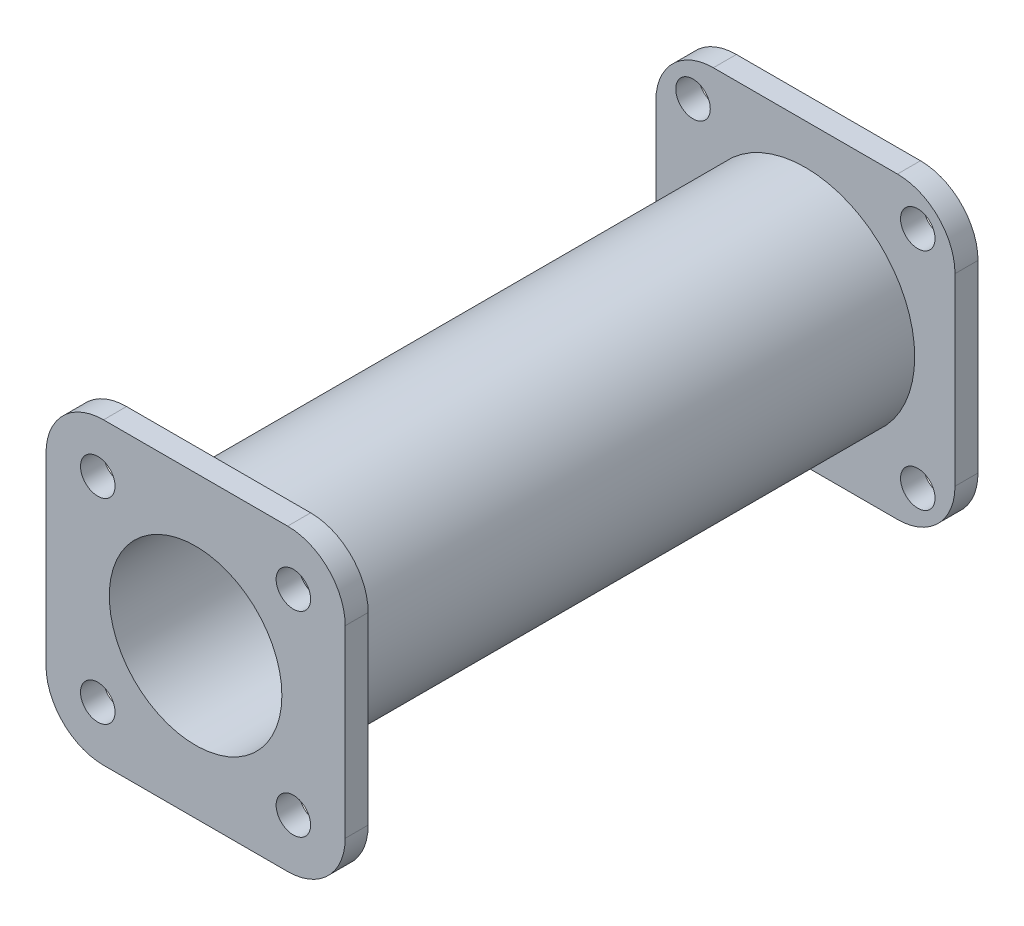
ISO-10303-21;
HEADER;
FILE_DESCRIPTION(('STEP AP214'),'2;1');
FILE_NAME('part.step','',(''),(''),'','','');
FILE_SCHEMA(('AUTOMOTIVE_DESIGN { 1 0 10303 214 1 1 1 1 }'));
ENDSEC;
DATA;
#1=APPLICATION_CONTEXT('core data for automotive mechanical design processes');
#2=APPLICATION_PROTOCOL_DEFINITION('international standard','automotive_design',2000,#1);
#3=PRODUCT_CONTEXT('',#1,'mechanical');
#4=PRODUCT('Part','Part','',(#3));
#5=PRODUCT_RELATED_PRODUCT_CATEGORY('part','',(#4));
#6=PRODUCT_DEFINITION_FORMATION('','',#4);
#7=PRODUCT_DEFINITION_CONTEXT('part definition',#1,'design');
#8=PRODUCT_DEFINITION('design','',#6,#7);
#9=PRODUCT_DEFINITION_SHAPE('','',#8);
#10=(LENGTH_UNIT() NAMED_UNIT(*) SI_UNIT(.MILLI.,.METRE.));
#11=(NAMED_UNIT(*) PLANE_ANGLE_UNIT() SI_UNIT($,.RADIAN.));
#12=(NAMED_UNIT(*) SI_UNIT($,.STERADIAN.) SOLID_ANGLE_UNIT());
#13=UNCERTAINTY_MEASURE_WITH_UNIT(LENGTH_MEASURE(1.E-05),#10,'distance_accuracy_value','');
#14=(GEOMETRIC_REPRESENTATION_CONTEXT(3) GLOBAL_UNCERTAINTY_ASSIGNED_CONTEXT((#13)) GLOBAL_UNIT_ASSIGNED_CONTEXT((#10,
#11,#12)) REPRESENTATION_CONTEXT('',''));
#15=CARTESIAN_POINT('',(0.,0.,0.));
#16=DIRECTION('',(0.,0.,1.));
#17=DIRECTION('',(1.,0.,0.));
#18=AXIS2_PLACEMENT_3D('',#15,#16,#17);
#19=CARTESIAN_POINT('',(0.,0.,55.));
#20=DIRECTION('',(0.,0.,-1.));
#21=DIRECTION('',(-1.,0.,0.));
#22=AXIS2_PLACEMENT_3D('',#19,#20,#21);
#23=CYLINDRICAL_SURFACE('',#22,9.5);
#24=CARTESIAN_POINT('',(0.,0.,2.));
#25=DIRECTION('',(0.,0.,1.));
#26=DIRECTION('',(1.,0.,0.));
#27=AXIS2_PLACEMENT_3D('',#24,#25,#26);
#28=CIRCLE('',#27,9.5);
#29=CARTESIAN_POINT('',(9.5,0.,2.));
#30=VERTEX_POINT('',#29);
#31=EDGE_CURVE('E269',#30,#30,#28,.T.);
#32=ORIENTED_EDGE('',*,*,#31,.T.);
#33=EDGE_LOOP('',(#32));
#34=FACE_BOUND('',#33,.T.);
#35=CARTESIAN_POINT('',(0.,0.,53.));
#36=DIRECTION('',(0.,0.,1.));
#37=DIRECTION('',(1.,0.,0.));
#38=AXIS2_PLACEMENT_3D('',#35,#36,#37);
#39=CIRCLE('',#38,9.5);
#40=CARTESIAN_POINT('',(9.5,0.,53.));
#41=VERTEX_POINT('',#40);
#42=EDGE_CURVE('E11',#41,#41,#39,.T.);
#43=ORIENTED_EDGE('',*,*,#42,.F.);
#44=EDGE_LOOP('',(#43));
#45=FACE_BOUND('',#44,.T.);
#46=ADVANCED_FACE('F43',(#34,#45),#23,.T.);
#47=CARTESIAN_POINT('',(-13.,0.,2.));
#48=DIRECTION('',(1.,0.,0.));
#49=DIRECTION('',(0.,1.,0.));
#50=AXIS2_PLACEMENT_3D('',#47,#48,#49);
#51=PLANE('',#50);
#52=DIRECTION('',(0.,-1.,0.));
#53=VECTOR('',#52,1.);
#54=CARTESIAN_POINT('',(-13.,0.,0.));
#55=LINE('',#54,#53);
#56=CARTESIAN_POINT('',(-13.,7.99999999999999,0.));
#57=VERTEX_POINT('',#56);
#58=CARTESIAN_POINT('',(-13.,-8.,0.));
#59=VERTEX_POINT('',#58);
#60=EDGE_CURVE('E159',#57,#59,#55,.T.);
#61=ORIENTED_EDGE('',*,*,#60,.T.);
#62=DIRECTION('',(0.,0.,-1.));
#63=VECTOR('',#62,1.);
#64=CARTESIAN_POINT('',(-13.,-8.,2.));
#65=LINE('',#64,#63);
#66=CARTESIAN_POINT('',(-13.,-8.,2.));
#67=VERTEX_POINT('',#66);
#68=EDGE_CURVE('E52',#67,#59,#65,.T.);
#69=ORIENTED_EDGE('',*,*,#68,.F.);
#70=DIRECTION('',(0.,-1.,0.));
#71=VECTOR('',#70,1.);
#72=CARTESIAN_POINT('',(-13.,0.,2.));
#73=LINE('',#72,#71);
#74=CARTESIAN_POINT('',(-13.,7.99999999999999,2.));
#75=VERTEX_POINT('',#74);
#76=EDGE_CURVE('E271',#75,#67,#73,.T.);
#77=ORIENTED_EDGE('',*,*,#76,.F.);
#78=DIRECTION('',(0.,0.,-1.));
#79=VECTOR('',#78,1.);
#80=CARTESIAN_POINT('',(-13.,7.99999999999999,2.));
#81=LINE('',#80,#79);
#82=EDGE_CURVE('E60',#75,#57,#81,.T.);
#83=ORIENTED_EDGE('',*,*,#82,.T.);
#84=EDGE_LOOP('',(#61,#69,#77,#83));
#85=FACE_BOUND('',#84,.T.);
#86=ADVANCED_FACE('F190',(#85),#51,.F.);
#87=CARTESIAN_POINT('',(-8.,-7.99999999999999,2.));
#88=DIRECTION('',(0.,0.,-1.));
#89=DIRECTION('',(-1.,0.,0.));
#90=AXIS2_PLACEMENT_3D('',#87,#88,#89);
#91=CYLINDRICAL_SURFACE('',#90,5.);
#92=CARTESIAN_POINT('',(-8.,-7.99999999999999,0.));
#93=DIRECTION('',(0.,0.,1.));
#94=DIRECTION('',(1.,0.,0.));
#95=AXIS2_PLACEMENT_3D('',#92,#93,#94);
#96=CIRCLE('',#95,5.);
#97=CARTESIAN_POINT('',(-7.99999999999999,-13.,0.));
#98=VERTEX_POINT('',#97);
#99=EDGE_CURVE('E161',#59,#98,#96,.T.);
#100=ORIENTED_EDGE('',*,*,#99,.T.);
#101=DIRECTION('',(0.,0.,-1.));
#102=VECTOR('',#101,1.);
#103=CARTESIAN_POINT('',(-7.99999999999999,-13.,2.));
#104=LINE('',#103,#102);
#105=CARTESIAN_POINT('',(-7.99999999999999,-13.,2.));
#106=VERTEX_POINT('',#105);
#107=EDGE_CURVE('E186',#106,#98,#104,.T.);
#108=ORIENTED_EDGE('',*,*,#107,.F.);
#109=CARTESIAN_POINT('',(-8.,-7.99999999999999,2.));
#110=DIRECTION('',(0.,0.,1.));
#111=DIRECTION('',(1.,0.,0.));
#112=AXIS2_PLACEMENT_3D('',#109,#110,#111);
#113=CIRCLE('',#112,5.);
#114=EDGE_CURVE('E100',#67,#106,#113,.T.);
#115=ORIENTED_EDGE('',*,*,#114,.F.);
#116=ORIENTED_EDGE('',*,*,#68,.T.);
#117=EDGE_LOOP('',(#100,#108,#115,#116));
#118=FACE_BOUND('',#117,.T.);
#119=ADVANCED_FACE('F189',(#118),#91,.T.);
#120=CARTESIAN_POINT('',(0.,-13.,2.));
#121=DIRECTION('',(0.,1.,0.));
#122=DIRECTION('',(-1.,0.,0.));
#123=AXIS2_PLACEMENT_3D('',#120,#121,#122);
#124=PLANE('',#123);
#125=DIRECTION('',(1.,0.,0.));
#126=VECTOR('',#125,1.);
#127=CARTESIAN_POINT('',(0.,-13.,0.));
#128=LINE('',#127,#126);
#129=CARTESIAN_POINT('',(8.,-13.,0.));
#130=VERTEX_POINT('',#129);
#131=EDGE_CURVE('E163',#98,#130,#128,.T.);
#132=ORIENTED_EDGE('',*,*,#131,.T.);
#133=DIRECTION('',(0.,0.,-1.));
#134=VECTOR('',#133,1.);
#135=CARTESIAN_POINT('',(8.,-13.,2.));
#136=LINE('',#135,#134);
#137=CARTESIAN_POINT('',(8.,-13.,2.));
#138=VERTEX_POINT('',#137);
#139=EDGE_CURVE('E184',#138,#130,#136,.T.);
#140=ORIENTED_EDGE('',*,*,#139,.F.);
#141=DIRECTION('',(1.,0.,0.));
#142=VECTOR('',#141,1.);
#143=CARTESIAN_POINT('',(0.,-13.,2.));
#144=LINE('',#143,#142);
#145=EDGE_CURVE('E274',#106,#138,#144,.T.);
#146=ORIENTED_EDGE('',*,*,#145,.F.);
#147=ORIENTED_EDGE('',*,*,#107,.T.);
#148=EDGE_LOOP('',(#132,#140,#146,#147));
#149=FACE_BOUND('',#148,.T.);
#150=ADVANCED_FACE('F287',(#149),#124,.F.);
#151=CARTESIAN_POINT('',(8.,-7.99999999999999,2.));
#152=DIRECTION('',(0.,0.,-1.));
#153=DIRECTION('',(-1.,0.,0.));
#154=AXIS2_PLACEMENT_3D('',#151,#152,#153);
#155=CYLINDRICAL_SURFACE('',#154,5.);
#156=CARTESIAN_POINT('',(8.,-7.99999999999999,0.));
#157=DIRECTION('',(0.,0.,1.));
#158=DIRECTION('',(1.,0.,0.));
#159=AXIS2_PLACEMENT_3D('',#156,#157,#158);
#160=CIRCLE('',#159,5.);
#161=CARTESIAN_POINT('',(13.,-8.,0.));
#162=VERTEX_POINT('',#161);
#163=EDGE_CURVE('E166',#162,#130,#160,.F.);
#164=ORIENTED_EDGE('',*,*,#163,.F.);
#165=DIRECTION('',(0.,0.,-1.));
#166=VECTOR('',#165,1.);
#167=CARTESIAN_POINT('',(13.,-8.,2.));
#168=LINE('',#167,#166);
#169=CARTESIAN_POINT('',(13.,-8.,2.));
#170=VERTEX_POINT('',#169);
#171=EDGE_CURVE('E182',#170,#162,#168,.T.);
#172=ORIENTED_EDGE('',*,*,#171,.F.);
#173=CARTESIAN_POINT('',(8.,-7.99999999999999,2.));
#174=DIRECTION('',(0.,0.,1.));
#175=DIRECTION('',(1.,0.,0.));
#176=AXIS2_PLACEMENT_3D('',#173,#174,#175);
#177=CIRCLE('',#176,5.);
#178=EDGE_CURVE('E276',#170,#138,#177,.F.);
#179=ORIENTED_EDGE('',*,*,#178,.T.);
#180=ORIENTED_EDGE('',*,*,#139,.T.);
#181=EDGE_LOOP('',(#164,#172,#179,#180));
#182=FACE_BOUND('',#181,.T.);
#183=ADVANCED_FACE('F283',(#182),#155,.T.);
#184=CARTESIAN_POINT('',(13.,0.,2.));
#185=DIRECTION('',(1.,0.,0.));
#186=DIRECTION('',(0.,0.,-1.));
#187=AXIS2_PLACEMENT_3D('',#184,#185,#186);
#188=PLANE('',#187);
#189=DIRECTION('',(0.,-1.,0.));
#190=VECTOR('',#189,1.);
#191=CARTESIAN_POINT('',(13.,0.,0.));
#192=LINE('',#191,#190);
#193=CARTESIAN_POINT('',(13.,8.,0.));
#194=VERTEX_POINT('',#193);
#195=EDGE_CURVE('E169',#194,#162,#192,.T.);
#196=ORIENTED_EDGE('',*,*,#195,.F.);
#197=DIRECTION('',(0.,0.,-1.));
#198=VECTOR('',#197,1.);
#199=CARTESIAN_POINT('',(13.,8.,2.));
#200=LINE('',#199,#198);
#201=CARTESIAN_POINT('',(13.,8.,2.));
#202=VERTEX_POINT('',#201);
#203=EDGE_CURVE('E128',#202,#194,#200,.T.);
#204=ORIENTED_EDGE('',*,*,#203,.F.);
#205=DIRECTION('',(0.,-1.,0.));
#206=VECTOR('',#205,1.);
#207=CARTESIAN_POINT('',(13.,0.,2.));
#208=LINE('',#207,#206);
#209=EDGE_CURVE('E138',#202,#170,#208,.T.);
#210=ORIENTED_EDGE('',*,*,#209,.T.);
#211=ORIENTED_EDGE('',*,*,#171,.T.);
#212=EDGE_LOOP('',(#196,#204,#210,#211));
#213=FACE_BOUND('',#212,.T.);
#214=ADVANCED_FACE('F280',(#213),#188,.T.);
#215=CARTESIAN_POINT('',(7.99999999999999,8.,2.));
#216=DIRECTION('',(0.,0.,-1.));
#217=DIRECTION('',(-1.,0.,0.));
#218=AXIS2_PLACEMENT_3D('',#215,#216,#217);
#219=CYLINDRICAL_SURFACE('',#218,5.);
#220=CARTESIAN_POINT('',(7.99999999999999,8.,0.));
#221=DIRECTION('',(0.,0.,1.));
#222=DIRECTION('',(1.,0.,0.));
#223=AXIS2_PLACEMENT_3D('',#220,#221,#222);
#224=CIRCLE('',#223,5.);
#225=CARTESIAN_POINT('',(7.99999999999999,13.,0.));
#226=VERTEX_POINT('',#225);
#227=EDGE_CURVE('E124',#226,#194,#224,.F.);
#228=ORIENTED_EDGE('',*,*,#227,.F.);
#229=DIRECTION('',(0.,0.,-1.));
#230=VECTOR('',#229,1.);
#231=CARTESIAN_POINT('',(7.99999999999999,13.,2.));
#232=LINE('',#231,#230);
#233=CARTESIAN_POINT('',(7.99999999999999,13.,2.));
#234=VERTEX_POINT('',#233);
#235=EDGE_CURVE('E119',#234,#226,#232,.T.);
#236=ORIENTED_EDGE('',*,*,#235,.F.);
#237=CARTESIAN_POINT('',(7.99999999999999,8.,2.));
#238=DIRECTION('',(0.,0.,1.));
#239=DIRECTION('',(1.,0.,0.));
#240=AXIS2_PLACEMENT_3D('',#237,#238,#239);
#241=CIRCLE('',#240,5.);
#242=EDGE_CURVE('E122',#234,#202,#241,.F.);
#243=ORIENTED_EDGE('',*,*,#242,.T.);
#244=ORIENTED_EDGE('',*,*,#203,.T.);
#245=EDGE_LOOP('',(#228,#236,#243,#244));
#246=FACE_BOUND('',#245,.T.);
#247=ADVANCED_FACE('F121',(#246),#219,.T.);
#248=CARTESIAN_POINT('',(0.,13.,2.));
#249=DIRECTION('',(0.,1.,0.));
#250=DIRECTION('',(-1.,0.,0.));
#251=AXIS2_PLACEMENT_3D('',#248,#249,#250);
#252=PLANE('',#251);
#253=DIRECTION('',(1.,0.,0.));
#254=VECTOR('',#253,1.);
#255=CARTESIAN_POINT('',(0.,13.,0.));
#256=LINE('',#255,#254);
#257=CARTESIAN_POINT('',(-7.99999999999999,13.,0.));
#258=VERTEX_POINT('',#257);
#259=EDGE_CURVE('E173',#258,#226,#256,.T.);
#260=ORIENTED_EDGE('',*,*,#259,.F.);
#261=DIRECTION('',(0.,0.,-1.));
#262=VECTOR('',#261,1.);
#263=CARTESIAN_POINT('',(-7.99999999999999,13.,2.));
#264=LINE('',#263,#262);
#265=CARTESIAN_POINT('',(-7.99999999999999,13.,2.));
#266=VERTEX_POINT('',#265);
#267=EDGE_CURVE('E87',#266,#258,#264,.T.);
#268=ORIENTED_EDGE('',*,*,#267,.F.);
#269=DIRECTION('',(1.,0.,0.));
#270=VECTOR('',#269,1.);
#271=CARTESIAN_POINT('',(0.,13.,2.));
#272=LINE('',#271,#270);
#273=EDGE_CURVE('E135',#266,#234,#272,.T.);
#274=ORIENTED_EDGE('',*,*,#273,.T.);
#275=ORIENTED_EDGE('',*,*,#235,.T.);
#276=EDGE_LOOP('',(#260,#268,#274,#275));
#277=FACE_BOUND('',#276,.T.);
#278=ADVANCED_FACE('F140',(#277),#252,.T.);
#279=CARTESIAN_POINT('',(-9.76776695296637,9.76776695296636,2.));
#280=DIRECTION('',(0.,0.,-1.));
#281=DIRECTION('',(-1.,0.,0.));
#282=AXIS2_PLACEMENT_3D('',#279,#280,#281);
#283=CYLINDRICAL_SURFACE('',#282,1.5);
#284=CARTESIAN_POINT('',(-9.76776695296637,9.76776695296636,2.));
#285=DIRECTION('',(0.,0.,1.));
#286=DIRECTION('',(1.,0.,0.));
#287=AXIS2_PLACEMENT_3D('',#284,#285,#286);
#288=CIRCLE('',#287,1.5);
#289=CARTESIAN_POINT('',(-8.26776695296638,9.76776695296636,2.));
#290=VERTEX_POINT('',#289);
#291=EDGE_CURVE('E262',#290,#290,#288,.T.);
#292=ORIENTED_EDGE('',*,*,#291,.T.);
#293=EDGE_LOOP('',(#292));
#294=FACE_BOUND('',#293,.T.);
#295=CARTESIAN_POINT('',(-9.76776695296637,9.76776695296636,0.));
#296=DIRECTION('',(0.,0.,1.));
#297=DIRECTION('',(1.,0.,0.));
#298=AXIS2_PLACEMENT_3D('',#295,#296,#297);
#299=CIRCLE('',#298,1.5);
#300=CARTESIAN_POINT('',(-8.26776695296638,9.76776695296636,0.));
#301=VERTEX_POINT('',#300);
#302=EDGE_CURVE('E156',#301,#301,#299,.T.);
#303=ORIENTED_EDGE('',*,*,#302,.F.);
#304=EDGE_LOOP('',(#303));
#305=FACE_BOUND('',#304,.T.);
#306=ADVANCED_FACE('F237',(#294,#305),#283,.F.);
#307=CARTESIAN_POINT('',(-9.76776695296637,-9.76776695296636,2.));
#308=DIRECTION('',(0.,0.,-1.));
#309=DIRECTION('',(-1.,0.,0.));
#310=AXIS2_PLACEMENT_3D('',#307,#308,#309);
#311=CYLINDRICAL_SURFACE('',#310,1.5);
#312=CARTESIAN_POINT('',(-9.76776695296637,-9.76776695296636,2.));
#313=DIRECTION('',(0.,0.,1.));
#314=DIRECTION('',(1.,0.,0.));
#315=AXIS2_PLACEMENT_3D('',#312,#313,#314);
#316=CIRCLE('',#315,1.5);
#317=CARTESIAN_POINT('',(-8.26776695296637,-9.76776695296636,2.));
#318=VERTEX_POINT('',#317);
#319=EDGE_CURVE('E259',#318,#318,#316,.T.);
#320=ORIENTED_EDGE('',*,*,#319,.T.);
#321=EDGE_LOOP('',(#320));
#322=FACE_BOUND('',#321,.T.);
#323=CARTESIAN_POINT('',(-9.76776695296637,-9.76776695296636,0.));
#324=DIRECTION('',(0.,0.,1.));
#325=DIRECTION('',(1.,0.,0.));
#326=AXIS2_PLACEMENT_3D('',#323,#324,#325);
#327=CIRCLE('',#326,1.5);
#328=CARTESIAN_POINT('',(-8.26776695296637,-9.76776695296636,0.));
#329=VERTEX_POINT('',#328);
#330=EDGE_CURVE('E153',#329,#329,#327,.T.);
#331=ORIENTED_EDGE('',*,*,#330,.F.);
#332=EDGE_LOOP('',(#331));
#333=FACE_BOUND('',#332,.T.);
#334=ADVANCED_FACE('F239',(#322,#333),#311,.F.);
#335=CARTESIAN_POINT('',(9.76776695296637,9.76776695296637,2.));
#336=DIRECTION('',(0.,0.,-1.));
#337=DIRECTION('',(-1.,0.,0.));
#338=AXIS2_PLACEMENT_3D('',#335,#336,#337);
#339=CYLINDRICAL_SURFACE('',#338,1.5);
#340=CARTESIAN_POINT('',(9.76776695296637,9.76776695296637,2.));
#341=DIRECTION('',(0.,0.,1.));
#342=DIRECTION('',(1.,0.,0.));
#343=AXIS2_PLACEMENT_3D('',#340,#341,#342);
#344=CIRCLE('',#343,1.5);
#345=CARTESIAN_POINT('',(11.2677669529664,9.76776695296637,2.));
#346=VERTEX_POINT('',#345);
#347=EDGE_CURVE('E257',#346,#346,#344,.T.);
#348=ORIENTED_EDGE('',*,*,#347,.T.);
#349=EDGE_LOOP('',(#348));
#350=FACE_BOUND('',#349,.T.);
#351=CARTESIAN_POINT('',(9.76776695296637,9.76776695296637,0.));
#352=DIRECTION('',(0.,0.,1.));
#353=DIRECTION('',(1.,0.,0.));
#354=AXIS2_PLACEMENT_3D('',#351,#352,#353);
#355=CIRCLE('',#354,1.5);
#356=CARTESIAN_POINT('',(11.2677669529664,9.76776695296637,0.));
#357=VERTEX_POINT('',#356);
#358=EDGE_CURVE('E149',#357,#357,#355,.T.);
#359=ORIENTED_EDGE('',*,*,#358,.F.);
#360=EDGE_LOOP('',(#359));
#361=FACE_BOUND('',#360,.T.);
#362=ADVANCED_FACE('F204',(#350,#361),#339,.F.);
#363=CARTESIAN_POINT('',(9.76776695296637,-9.76776695296637,2.));
#364=DIRECTION('',(0.,0.,-1.));
#365=DIRECTION('',(-1.,0.,0.));
#366=AXIS2_PLACEMENT_3D('',#363,#364,#365);
#367=CYLINDRICAL_SURFACE('',#366,1.5);
#368=CARTESIAN_POINT('',(9.76776695296637,-9.76776695296637,2.));
#369=DIRECTION('',(0.,0.,1.));
#370=DIRECTION('',(1.,0.,0.));
#371=AXIS2_PLACEMENT_3D('',#368,#369,#370);
#372=CIRCLE('',#371,1.5);
#373=CARTESIAN_POINT('',(11.2677669529664,-9.76776695296637,2.));
#374=VERTEX_POINT('',#373);
#375=EDGE_CURVE('E178',#374,#374,#372,.T.);
#376=ORIENTED_EDGE('',*,*,#375,.T.);
#377=EDGE_LOOP('',(#376));
#378=FACE_BOUND('',#377,.T.);
#379=CARTESIAN_POINT('',(9.76776695296637,-9.76776695296637,0.));
#380=DIRECTION('',(0.,0.,1.));
#381=DIRECTION('',(1.,0.,0.));
#382=AXIS2_PLACEMENT_3D('',#379,#380,#381);
#383=CIRCLE('',#382,1.5);
#384=CARTESIAN_POINT('',(11.2677669529664,-9.76776695296637,0.));
#385=VERTEX_POINT('',#384);
#386=EDGE_CURVE('E146',#385,#385,#383,.T.);
#387=ORIENTED_EDGE('',*,*,#386,.F.);
#388=EDGE_LOOP('',(#387));
#389=FACE_BOUND('',#388,.T.);
#390=ADVANCED_FACE('F45',(#378,#389),#367,.F.);
#391=CARTESIAN_POINT('',(-8.,7.99999999999999,2.));
#392=DIRECTION('',(0.,0.,-1.));
#393=DIRECTION('',(-1.,0.,0.));
#394=AXIS2_PLACEMENT_3D('',#391,#392,#393);
#395=CYLINDRICAL_SURFACE('',#394,5.);
#396=CARTESIAN_POINT('',(-8.,7.99999999999999,0.));
#397=DIRECTION('',(0.,0.,1.));
#398=DIRECTION('',(1.,0.,0.));
#399=AXIS2_PLACEMENT_3D('',#396,#397,#398);
#400=CIRCLE('',#399,5.);
#401=EDGE_CURVE('E175',#57,#258,#400,.F.);
#402=ORIENTED_EDGE('',*,*,#401,.F.);
#403=ORIENTED_EDGE('',*,*,#82,.F.);
#404=CARTESIAN_POINT('',(-8.,7.99999999999999,2.));
#405=DIRECTION('',(0.,0.,1.));
#406=DIRECTION('',(1.,0.,0.));
#407=AXIS2_PLACEMENT_3D('',#404,#405,#406);
#408=CIRCLE('',#407,5.);
#409=EDGE_CURVE('E141',#75,#266,#408,.F.);
#410=ORIENTED_EDGE('',*,*,#409,.T.);
#411=ORIENTED_EDGE('',*,*,#267,.T.);
#412=EDGE_LOOP('',(#402,#403,#410,#411));
#413=FACE_BOUND('',#412,.T.);
#414=ADVANCED_FACE('F195',(#413),#395,.T.);
#415=CARTESIAN_POINT('',(0.,0.,2.));
#416=DIRECTION('',(0.,0.,1.));
#417=DIRECTION('',(1.,0.,0.));
#418=AXIS2_PLACEMENT_3D('',#415,#416,#417);
#419=PLANE('',#418);
#420=ORIENTED_EDGE('',*,*,#375,.F.);
#421=EDGE_LOOP('',(#420));
#422=FACE_BOUND('',#421,.T.);
#423=ORIENTED_EDGE('',*,*,#347,.F.);
#424=EDGE_LOOP('',(#423));
#425=FACE_BOUND('',#424,.T.);
#426=ORIENTED_EDGE('',*,*,#319,.F.);
#427=EDGE_LOOP('',(#426));
#428=FACE_BOUND('',#427,.T.);
#429=ORIENTED_EDGE('',*,*,#291,.F.);
#430=EDGE_LOOP('',(#429));
#431=FACE_BOUND('',#430,.T.);
#432=ORIENTED_EDGE('',*,*,#31,.F.);
#433=EDGE_LOOP('',(#432));
#434=FACE_BOUND('',#433,.T.);
#435=ORIENTED_EDGE('',*,*,#76,.T.);
#436=ORIENTED_EDGE('',*,*,#114,.T.);
#437=ORIENTED_EDGE('',*,*,#145,.T.);
#438=ORIENTED_EDGE('',*,*,#178,.F.);
#439=ORIENTED_EDGE('',*,*,#209,.F.);
#440=ORIENTED_EDGE('',*,*,#242,.F.);
#441=ORIENTED_EDGE('',*,*,#273,.F.);
#442=ORIENTED_EDGE('',*,*,#409,.F.);
#443=EDGE_LOOP('',(#435,#436,#437,#438,#439,#440,#441,#442));
#444=FACE_BOUND('',#443,.T.);
#445=ADVANCED_FACE('F133',(#422,#425,#428,#431,#434,#444),#419,.T.);
#446=CARTESIAN_POINT('',(0.,0.,0.));
#447=DIRECTION('',(0.,0.,1.));
#448=DIRECTION('',(1.,0.,0.));
#449=AXIS2_PLACEMENT_3D('',#446,#447,#448);
#450=PLANE('',#449);
#451=ORIENTED_EDGE('',*,*,#386,.T.);
#452=EDGE_LOOP('',(#451));
#453=FACE_BOUND('',#452,.T.);
#454=ORIENTED_EDGE('',*,*,#358,.T.);
#455=EDGE_LOOP('',(#454));
#456=FACE_BOUND('',#455,.T.);
#457=ORIENTED_EDGE('',*,*,#330,.T.);
#458=EDGE_LOOP('',(#457));
#459=FACE_BOUND('',#458,.T.);
#460=ORIENTED_EDGE('',*,*,#302,.T.);
#461=EDGE_LOOP('',(#460));
#462=FACE_BOUND('',#461,.T.);
#463=ORIENTED_EDGE('',*,*,#60,.F.);
#464=ORIENTED_EDGE('',*,*,#401,.T.);
#465=ORIENTED_EDGE('',*,*,#259,.T.);
#466=ORIENTED_EDGE('',*,*,#227,.T.);
#467=ORIENTED_EDGE('',*,*,#195,.T.);
#468=ORIENTED_EDGE('',*,*,#163,.T.);
#469=ORIENTED_EDGE('',*,*,#131,.F.);
#470=ORIENTED_EDGE('',*,*,#99,.F.);
#471=EDGE_LOOP('',(#463,#464,#465,#466,#467,#468,#469,#470));
#472=FACE_BOUND('',#471,.T.);
#473=CARTESIAN_POINT('',(0.,0.,0.));
#474=DIRECTION('',(0.,0.,1.));
#475=DIRECTION('',(1.,0.,0.));
#476=AXIS2_PLACEMENT_3D('',#473,#474,#475);
#477=CIRCLE('',#476,7.5);
#478=CARTESIAN_POINT('',(7.5,0.,0.));
#479=VERTEX_POINT('',#478);
#480=EDGE_CURVE('E572',#479,#479,#477,.T.);
#481=ORIENTED_EDGE('',*,*,#480,.T.);
#482=EDGE_LOOP('',(#481));
#483=FACE_BOUND('',#482,.T.);
#484=ADVANCED_FACE('F192',(#453,#456,#459,#462,#472,#483),#450,.F.);
#485=CARTESIAN_POINT('',(0.,0.,55.));
#486=DIRECTION('',(0.,0.,-1.));
#487=DIRECTION('',(-1.,0.,0.));
#488=AXIS2_PLACEMENT_3D('',#485,#486,#487);
#489=CYLINDRICAL_SURFACE('',#488,7.5);
#490=CARTESIAN_POINT('',(0.,0.,55.));
#491=DIRECTION('',(0.,0.,1.));
#492=DIRECTION('',(1.,0.,0.));
#493=AXIS2_PLACEMENT_3D('',#490,#491,#492);
#494=CIRCLE('',#493,7.5);
#495=CARTESIAN_POINT('',(7.5,0.,55.));
#496=VERTEX_POINT('',#495);
#497=EDGE_CURVE('E150',#496,#496,#494,.T.);
#498=ORIENTED_EDGE('',*,*,#497,.T.);
#499=EDGE_LOOP('',(#498));
#500=FACE_BOUND('',#499,.T.);
#501=ORIENTED_EDGE('',*,*,#480,.F.);
#502=EDGE_LOOP('',(#501));
#503=FACE_BOUND('',#502,.T.);
#504=ADVANCED_FACE('F223',(#500,#503),#489,.F.);
#505=CARTESIAN_POINT('',(0.,0.,55.));
#506=DIRECTION('',(0.,0.,1.));
#507=DIRECTION('',(1.,0.,0.));
#508=AXIS2_PLACEMENT_3D('',#505,#506,#507);
#509=PLANE('',#508);
#510=ORIENTED_EDGE('',*,*,#497,.F.);
#511=EDGE_LOOP('',(#510));
#512=FACE_BOUND('',#511,.T.);
#513=CARTESIAN_POINT('',(8.50000000000001,8.5,55.));
#514=DIRECTION('',(0.,0.,1.));
#515=DIRECTION('',(1.,0.,0.));
#516=AXIS2_PLACEMENT_3D('',#513,#514,#515);
#517=CIRCLE('',#516,1.5);
#518=CARTESIAN_POINT('',(10.,8.5,55.));
#519=VERTEX_POINT('',#518);
#520=EDGE_CURVE('E533',#519,#519,#517,.F.);
#521=ORIENTED_EDGE('',*,*,#520,.T.);
#522=EDGE_LOOP('',(#521));
#523=FACE_BOUND('',#522,.T.);
#524=CARTESIAN_POINT('',(8.50000000000001,-8.5,55.));
#525=DIRECTION('',(0.,0.,1.));
#526=DIRECTION('',(1.,0.,0.));
#527=AXIS2_PLACEMENT_3D('',#524,#525,#526);
#528=CIRCLE('',#527,1.5);
#529=CARTESIAN_POINT('',(10.,-8.5,55.));
#530=VERTEX_POINT('',#529);
#531=EDGE_CURVE('E536',#530,#530,#528,.T.);
#532=ORIENTED_EDGE('',*,*,#531,.F.);
#533=EDGE_LOOP('',(#532));
#534=FACE_BOUND('',#533,.T.);
#535=CARTESIAN_POINT('',(-8.49999999999999,-8.5,55.));
#536=DIRECTION('',(0.,0.,1.));
#537=DIRECTION('',(1.,0.,0.));
#538=AXIS2_PLACEMENT_3D('',#535,#536,#537);
#539=CIRCLE('',#538,1.5);
#540=CARTESIAN_POINT('',(-6.99999999999999,-8.5,55.));
#541=VERTEX_POINT('',#540);
#542=EDGE_CURVE('E539',#541,#541,#539,.T.);
#543=ORIENTED_EDGE('',*,*,#542,.F.);
#544=EDGE_LOOP('',(#543));
#545=FACE_BOUND('',#544,.T.);
#546=DIRECTION('',(1.,0.,0.));
#547=VECTOR('',#546,1.);
#548=CARTESIAN_POINT('',(0.,13.,55.));
#549=LINE('',#548,#547);
#550=CARTESIAN_POINT('',(-8.,13.,55.));
#551=VERTEX_POINT('',#550);
#552=CARTESIAN_POINT('',(8.,13.,55.));
#553=VERTEX_POINT('',#552);
#554=EDGE_CURVE('E542',#551,#553,#549,.T.);
#555=ORIENTED_EDGE('',*,*,#554,.F.);
#556=CARTESIAN_POINT('',(-8.,8.,55.));
#557=DIRECTION('',(0.,0.,1.));
#558=DIRECTION('',(1.,0.,0.));
#559=AXIS2_PLACEMENT_3D('',#556,#557,#558);
#560=CIRCLE('',#559,5.);
#561=CARTESIAN_POINT('',(-13.,8.,55.));
#562=VERTEX_POINT('',#561);
#563=EDGE_CURVE('E545',#551,#562,#560,.T.);
#564=ORIENTED_EDGE('',*,*,#563,.T.);
#565=DIRECTION('',(0.,-1.,0.));
#566=VECTOR('',#565,1.);
#567=CARTESIAN_POINT('',(-13.,0.,55.));
#568=LINE('',#567,#566);
#569=CARTESIAN_POINT('',(-13.,-8.,55.));
#570=VERTEX_POINT('',#569);
#571=EDGE_CURVE('E548',#562,#570,#568,.T.);
#572=ORIENTED_EDGE('',*,*,#571,.T.);
#573=CARTESIAN_POINT('',(-7.99999999999999,-8.,55.));
#574=DIRECTION('',(0.,0.,1.));
#575=DIRECTION('',(1.,0.,0.));
#576=AXIS2_PLACEMENT_3D('',#573,#574,#575);
#577=CIRCLE('',#576,5.);
#578=CARTESIAN_POINT('',(-7.99999999999999,-13.,55.));
#579=VERTEX_POINT('',#578);
#580=EDGE_CURVE('E551',#579,#570,#577,.F.);
#581=ORIENTED_EDGE('',*,*,#580,.F.);
#582=DIRECTION('',(1.,0.,0.));
#583=VECTOR('',#582,1.);
#584=CARTESIAN_POINT('',(0.,-13.,55.));
#585=LINE('',#584,#583);
#586=CARTESIAN_POINT('',(8.,-13.,55.));
#587=VERTEX_POINT('',#586);
#588=EDGE_CURVE('E554',#579,#587,#585,.T.);
#589=ORIENTED_EDGE('',*,*,#588,.T.);
#590=CARTESIAN_POINT('',(8.,-8.,55.));
#591=DIRECTION('',(0.,0.,1.));
#592=DIRECTION('',(1.,0.,0.));
#593=AXIS2_PLACEMENT_3D('',#590,#591,#592);
#594=CIRCLE('',#593,5.);
#595=CARTESIAN_POINT('',(13.,-8.,55.));
#596=VERTEX_POINT('',#595);
#597=EDGE_CURVE('E557',#587,#596,#594,.T.);
#598=ORIENTED_EDGE('',*,*,#597,.T.);
#599=DIRECTION('',(0.,-1.,0.));
#600=VECTOR('',#599,1.);
#601=CARTESIAN_POINT('',(13.,0.,55.));
#602=LINE('',#601,#600);
#603=CARTESIAN_POINT('',(13.,8.,55.));
#604=VERTEX_POINT('',#603);
#605=EDGE_CURVE('E560',#604,#596,#602,.T.);
#606=ORIENTED_EDGE('',*,*,#605,.F.);
#607=CARTESIAN_POINT('',(8.,8.,55.));
#608=DIRECTION('',(0.,0.,1.));
#609=DIRECTION('',(1.,0.,0.));
#610=AXIS2_PLACEMENT_3D('',#607,#608,#609);
#611=CIRCLE('',#610,5.);
#612=EDGE_CURVE('E563',#604,#553,#611,.T.);
#613=ORIENTED_EDGE('',*,*,#612,.T.);
#614=EDGE_LOOP('',(#555,#564,#572,#581,#589,#598,#606,#613));
#615=FACE_BOUND('',#614,.T.);
#616=CARTESIAN_POINT('',(-8.5,8.5,55.));
#617=DIRECTION('',(0.,0.,1.));
#618=DIRECTION('',(1.,0.,0.));
#619=AXIS2_PLACEMENT_3D('',#616,#617,#618);
#620=CIRCLE('',#619,1.5);
#621=CARTESIAN_POINT('',(-7.,8.5,55.));
#622=VERTEX_POINT('',#621);
#623=EDGE_CURVE('E566',#622,#622,#620,.F.);
#624=ORIENTED_EDGE('',*,*,#623,.T.);
#625=EDGE_LOOP('',(#624));
#626=FACE_BOUND('',#625,.T.);
#627=ADVANCED_FACE('F221',(#512,#523,#534,#545,#615,#626),#509,.T.);
#628=CARTESIAN_POINT('',(0.,13.,53.));
#629=DIRECTION('',(0.,-1.,0.));
#630=DIRECTION('',(0.,0.,-1.));
#631=AXIS2_PLACEMENT_3D('',#628,#629,#630);
#632=PLANE('',#631);
#633=ORIENTED_EDGE('',*,*,#554,.T.);
#634=DIRECTION('',(0.,0.,1.));
#635=VECTOR('',#634,1.);
#636=CARTESIAN_POINT('',(8.,13.,53.));
#637=LINE('',#636,#635);
#638=CARTESIAN_POINT('',(8.,13.,53.));
#639=VERTEX_POINT('',#638);
#640=EDGE_CURVE('E569',#639,#553,#637,.T.);
#641=ORIENTED_EDGE('',*,*,#640,.F.);
#642=DIRECTION('',(1.,0.,0.));
#643=VECTOR('',#642,1.);
#644=CARTESIAN_POINT('',(0.,13.,53.));
#645=LINE('',#644,#643);
#646=CARTESIAN_POINT('',(-8.,13.,53.));
#647=VERTEX_POINT('',#646);
#648=EDGE_CURVE('E517',#647,#639,#645,.T.);
#649=ORIENTED_EDGE('',*,*,#648,.F.);
#650=DIRECTION('',(0.,0.,1.));
#651=VECTOR('',#650,1.);
#652=CARTESIAN_POINT('',(-8.,13.,53.));
#653=LINE('',#652,#651);
#654=EDGE_CURVE('E522',#647,#551,#653,.T.);
#655=ORIENTED_EDGE('',*,*,#654,.T.);
#656=EDGE_LOOP('',(#633,#641,#649,#655));
#657=FACE_BOUND('',#656,.T.);
#658=ADVANCED_FACE('F361',(#657),#632,.F.);
#659=CARTESIAN_POINT('',(8.,8.,53.));
#660=DIRECTION('',(0.,0.,1.));
#661=DIRECTION('',(1.,0.,0.));
#662=AXIS2_PLACEMENT_3D('',#659,#660,#661);
#663=CYLINDRICAL_SURFACE('',#662,5.);
#664=ORIENTED_EDGE('',*,*,#612,.F.);
#665=DIRECTION('',(0.,0.,1.));
#666=VECTOR('',#665,1.);
#667=CARTESIAN_POINT('',(13.,8.,53.));
#668=LINE('',#667,#666);
#669=CARTESIAN_POINT('',(13.,8.,53.));
#670=VERTEX_POINT('',#669);
#671=EDGE_CURVE('E573',#670,#604,#668,.T.);
#672=ORIENTED_EDGE('',*,*,#671,.F.);
#673=CARTESIAN_POINT('',(8.,8.,53.));
#674=DIRECTION('',(0.,0.,1.));
#675=DIRECTION('',(1.,0.,0.));
#676=AXIS2_PLACEMENT_3D('',#673,#674,#675);
#677=CIRCLE('',#676,5.);
#678=EDGE_CURVE('E523',#670,#639,#677,.T.);
#679=ORIENTED_EDGE('',*,*,#678,.T.);
#680=ORIENTED_EDGE('',*,*,#640,.T.);
#681=EDGE_LOOP('',(#664,#672,#679,#680));
#682=FACE_BOUND('',#681,.T.);
#683=ADVANCED_FACE('F374',(#682),#663,.T.);
#684=CARTESIAN_POINT('',(13.,0.,53.));
#685=DIRECTION('',(-1.,0.,0.));
#686=DIRECTION('',(0.,-1.,0.));
#687=AXIS2_PLACEMENT_3D('',#684,#685,#686);
#688=PLANE('',#687);
#689=ORIENTED_EDGE('',*,*,#605,.T.);
#690=DIRECTION('',(0.,0.,1.));
#691=VECTOR('',#690,1.);
#692=CARTESIAN_POINT('',(13.,-8.,53.));
#693=LINE('',#692,#691);
#694=CARTESIAN_POINT('',(13.,-8.,53.));
#695=VERTEX_POINT('',#694);
#696=EDGE_CURVE('E576',#695,#596,#693,.T.);
#697=ORIENTED_EDGE('',*,*,#696,.F.);
#698=DIRECTION('',(0.,-1.,0.));
#699=VECTOR('',#698,1.);
#700=CARTESIAN_POINT('',(13.,0.,53.));
#701=LINE('',#700,#699);
#702=EDGE_CURVE('E529',#670,#695,#701,.T.);
#703=ORIENTED_EDGE('',*,*,#702,.F.);
#704=ORIENTED_EDGE('',*,*,#671,.T.);
#705=EDGE_LOOP('',(#689,#697,#703,#704));
#706=FACE_BOUND('',#705,.T.);
#707=ADVANCED_FACE('F383',(#706),#688,.F.);
#708=CARTESIAN_POINT('',(8.,-8.,53.));
#709=DIRECTION('',(0.,0.,1.));
#710=DIRECTION('',(1.,0.,0.));
#711=AXIS2_PLACEMENT_3D('',#708,#709,#710);
#712=CYLINDRICAL_SURFACE('',#711,5.);
#713=ORIENTED_EDGE('',*,*,#597,.F.);
#714=DIRECTION('',(0.,0.,1.));
#715=VECTOR('',#714,1.);
#716=CARTESIAN_POINT('',(8.,-13.,53.));
#717=LINE('',#716,#715);
#718=CARTESIAN_POINT('',(8.,-13.,53.));
#719=VERTEX_POINT('',#718);
#720=EDGE_CURVE('E579',#719,#587,#717,.T.);
#721=ORIENTED_EDGE('',*,*,#720,.F.);
#722=CARTESIAN_POINT('',(8.,-8.,53.));
#723=DIRECTION('',(0.,0.,1.));
#724=DIRECTION('',(1.,0.,0.));
#725=AXIS2_PLACEMENT_3D('',#722,#723,#724);
#726=CIRCLE('',#725,5.);
#727=EDGE_CURVE('E656',#719,#695,#726,.T.);
#728=ORIENTED_EDGE('',*,*,#727,.T.);
#729=ORIENTED_EDGE('',*,*,#696,.T.);
#730=EDGE_LOOP('',(#713,#721,#728,#729));
#731=FACE_BOUND('',#730,.T.);
#732=ADVANCED_FACE('F392',(#731),#712,.T.);
#733=CARTESIAN_POINT('',(0.,-13.,53.));
#734=DIRECTION('',(0.,-1.,0.));
#735=DIRECTION('',(0.,0.,-1.));
#736=AXIS2_PLACEMENT_3D('',#733,#734,#735);
#737=PLANE('',#736);
#738=ORIENTED_EDGE('',*,*,#588,.F.);
#739=DIRECTION('',(0.,0.,1.));
#740=VECTOR('',#739,1.);
#741=CARTESIAN_POINT('',(-7.99999999999999,-13.,53.));
#742=LINE('',#741,#740);
#743=CARTESIAN_POINT('',(-7.99999999999999,-13.,53.));
#744=VERTEX_POINT('',#743);
#745=EDGE_CURVE('E582',#744,#579,#742,.T.);
#746=ORIENTED_EDGE('',*,*,#745,.F.);
#747=DIRECTION('',(1.,0.,0.));
#748=VECTOR('',#747,1.);
#749=CARTESIAN_POINT('',(0.,-13.,53.));
#750=LINE('',#749,#748);
#751=EDGE_CURVE('E657',#744,#719,#750,.T.);
#752=ORIENTED_EDGE('',*,*,#751,.T.);
#753=ORIENTED_EDGE('',*,*,#720,.T.);
#754=EDGE_LOOP('',(#738,#746,#752,#753));
#755=FACE_BOUND('',#754,.T.);
#756=ADVANCED_FACE('F401',(#755),#737,.T.);
#757=CARTESIAN_POINT('',(-7.99999999999999,-8.,53.));
#758=DIRECTION('',(0.,0.,1.));
#759=DIRECTION('',(1.,0.,0.));
#760=AXIS2_PLACEMENT_3D('',#757,#758,#759);
#761=CYLINDRICAL_SURFACE('',#760,5.);
#762=ORIENTED_EDGE('',*,*,#580,.T.);
#763=DIRECTION('',(0.,0.,1.));
#764=VECTOR('',#763,1.);
#765=CARTESIAN_POINT('',(-13.,-8.,53.));
#766=LINE('',#765,#764);
#767=CARTESIAN_POINT('',(-13.,-8.,53.));
#768=VERTEX_POINT('',#767);
#769=EDGE_CURVE('E585',#768,#570,#766,.T.);
#770=ORIENTED_EDGE('',*,*,#769,.F.);
#771=CARTESIAN_POINT('',(-7.99999999999999,-8.,53.));
#772=DIRECTION('',(0.,0.,1.));
#773=DIRECTION('',(1.,0.,0.));
#774=AXIS2_PLACEMENT_3D('',#771,#772,#773);
#775=CIRCLE('',#774,5.);
#776=EDGE_CURVE('E662',#744,#768,#775,.F.);
#777=ORIENTED_EDGE('',*,*,#776,.F.);
#778=ORIENTED_EDGE('',*,*,#745,.T.);
#779=EDGE_LOOP('',(#762,#770,#777,#778));
#780=FACE_BOUND('',#779,.T.);
#781=ADVANCED_FACE('F410',(#780),#761,.T.);
#782=CARTESIAN_POINT('',(-13.,0.,53.));
#783=DIRECTION('',(-1.,0.,0.));
#784=DIRECTION('',(0.,-1.,0.));
#785=AXIS2_PLACEMENT_3D('',#782,#783,#784);
#786=PLANE('',#785);
#787=ORIENTED_EDGE('',*,*,#571,.F.);
#788=DIRECTION('',(0.,0.,1.));
#789=VECTOR('',#788,1.);
#790=CARTESIAN_POINT('',(-13.,8.,53.));
#791=LINE('',#790,#789);
#792=CARTESIAN_POINT('',(-13.,8.,53.));
#793=VERTEX_POINT('',#792);
#794=EDGE_CURVE('E526',#793,#562,#791,.T.);
#795=ORIENTED_EDGE('',*,*,#794,.F.);
#796=DIRECTION('',(0.,-1.,0.));
#797=VECTOR('',#796,1.);
#798=CARTESIAN_POINT('',(-13.,0.,53.));
#799=LINE('',#798,#797);
#800=EDGE_CURVE('E664',#793,#768,#799,.T.);
#801=ORIENTED_EDGE('',*,*,#800,.T.);
#802=ORIENTED_EDGE('',*,*,#769,.T.);
#803=EDGE_LOOP('',(#787,#795,#801,#802));
#804=FACE_BOUND('',#803,.T.);
#805=ADVANCED_FACE('F419',(#804),#786,.T.);
#806=CARTESIAN_POINT('',(-8.,8.,53.));
#807=DIRECTION('',(0.,0.,1.));
#808=DIRECTION('',(1.,0.,0.));
#809=AXIS2_PLACEMENT_3D('',#806,#807,#808);
#810=CYLINDRICAL_SURFACE('',#809,5.);
#811=ORIENTED_EDGE('',*,*,#563,.F.);
#812=ORIENTED_EDGE('',*,*,#654,.F.);
#813=CARTESIAN_POINT('',(-8.,8.,53.));
#814=DIRECTION('',(0.,0.,1.));
#815=DIRECTION('',(1.,0.,0.));
#816=AXIS2_PLACEMENT_3D('',#813,#814,#815);
#817=CIRCLE('',#816,5.);
#818=EDGE_CURVE('E618',#647,#793,#817,.T.);
#819=ORIENTED_EDGE('',*,*,#818,.T.);
#820=ORIENTED_EDGE('',*,*,#794,.T.);
#821=EDGE_LOOP('',(#811,#812,#819,#820));
#822=FACE_BOUND('',#821,.T.);
#823=ADVANCED_FACE('F428',(#822),#810,.T.);
#824=CARTESIAN_POINT('',(-8.49999999999999,-8.5,53.));
#825=DIRECTION('',(0.,0.,1.));
#826=DIRECTION('',(1.,0.,0.));
#827=AXIS2_PLACEMENT_3D('',#824,#825,#826);
#828=CYLINDRICAL_SURFACE('',#827,1.5);
#829=CARTESIAN_POINT('',(-8.49999999999999,-8.5,53.));
#830=DIRECTION('',(0.,0.,1.));
#831=DIRECTION('',(1.,0.,0.));
#832=AXIS2_PLACEMENT_3D('',#829,#830,#831);
#833=CIRCLE('',#832,1.5);
#834=CARTESIAN_POINT('',(-6.99999999999999,-8.5,53.));
#835=VERTEX_POINT('',#834);
#836=EDGE_CURVE('E509',#835,#835,#833,.T.);
#837=ORIENTED_EDGE('',*,*,#836,.F.);
#838=EDGE_LOOP('',(#837));
#839=FACE_BOUND('',#838,.T.);
#840=ORIENTED_EDGE('',*,*,#542,.T.);
#841=EDGE_LOOP('',(#840));
#842=FACE_BOUND('',#841,.T.);
#843=ADVANCED_FACE('F437',(#839,#842),#828,.F.);
#844=CARTESIAN_POINT('',(8.50000000000001,-8.5,53.));
#845=DIRECTION('',(0.,0.,1.));
#846=DIRECTION('',(1.,0.,0.));
#847=AXIS2_PLACEMENT_3D('',#844,#845,#846);
#848=CYLINDRICAL_SURFACE('',#847,1.5);
#849=CARTESIAN_POINT('',(8.50000000000001,-8.5,53.));
#850=DIRECTION('',(0.,0.,1.));
#851=DIRECTION('',(1.,0.,0.));
#852=AXIS2_PLACEMENT_3D('',#849,#850,#851);
#853=CIRCLE('',#852,1.5);
#854=CARTESIAN_POINT('',(10.,-8.5,53.));
#855=VERTEX_POINT('',#854);
#856=EDGE_CURVE('E505',#855,#855,#853,.T.);
#857=ORIENTED_EDGE('',*,*,#856,.F.);
#858=EDGE_LOOP('',(#857));
#859=FACE_BOUND('',#858,.T.);
#860=ORIENTED_EDGE('',*,*,#531,.T.);
#861=EDGE_LOOP('',(#860));
#862=FACE_BOUND('',#861,.T.);
#863=ADVANCED_FACE('F446',(#859,#862),#848,.F.);
#864=CARTESIAN_POINT('',(8.50000000000001,8.5,53.));
#865=DIRECTION('',(0.,0.,1.));
#866=DIRECTION('',(1.,0.,0.));
#867=AXIS2_PLACEMENT_3D('',#864,#865,#866);
#868=CYLINDRICAL_SURFACE('',#867,1.5);
#869=CARTESIAN_POINT('',(8.50000000000001,8.5,53.));
#870=DIRECTION('',(0.,0.,1.));
#871=DIRECTION('',(1.,0.,0.));
#872=AXIS2_PLACEMENT_3D('',#869,#870,#871);
#873=CIRCLE('',#872,1.5);
#874=CARTESIAN_POINT('',(10.,8.5,53.));
#875=VERTEX_POINT('',#874);
#876=EDGE_CURVE('E501',#875,#875,#873,.F.);
#877=ORIENTED_EDGE('',*,*,#876,.T.);
#878=EDGE_LOOP('',(#877));
#879=FACE_BOUND('',#878,.T.);
#880=ORIENTED_EDGE('',*,*,#520,.F.);
#881=EDGE_LOOP('',(#880));
#882=FACE_BOUND('',#881,.T.);
#883=ADVANCED_FACE('F455',(#879,#882),#868,.F.);
#884=CARTESIAN_POINT('',(-8.5,8.5,53.));
#885=DIRECTION('',(0.,0.,1.));
#886=DIRECTION('',(1.,0.,0.));
#887=AXIS2_PLACEMENT_3D('',#884,#885,#886);
#888=CYLINDRICAL_SURFACE('',#887,1.5);
#889=CARTESIAN_POINT('',(-8.5,8.5,53.));
#890=DIRECTION('',(0.,0.,1.));
#891=DIRECTION('',(1.,0.,0.));
#892=AXIS2_PLACEMENT_3D('',#889,#890,#891);
#893=CIRCLE('',#892,1.5);
#894=CARTESIAN_POINT('',(-7.,8.5,53.));
#895=VERTEX_POINT('',#894);
#896=EDGE_CURVE('E521',#895,#895,#893,.F.);
#897=ORIENTED_EDGE('',*,*,#896,.T.);
#898=EDGE_LOOP('',(#897));
#899=FACE_BOUND('',#898,.T.);
#900=ORIENTED_EDGE('',*,*,#623,.F.);
#901=EDGE_LOOP('',(#900));
#902=FACE_BOUND('',#901,.T.);
#903=ADVANCED_FACE('F464',(#899,#902),#888,.F.);
#904=CARTESIAN_POINT('',(0.,0.,53.));
#905=DIRECTION('',(0.,0.,1.));
#906=DIRECTION('',(1.,0.,0.));
#907=AXIS2_PLACEMENT_3D('',#904,#905,#906);
#908=PLANE('',#907);
#909=ORIENTED_EDGE('',*,*,#876,.F.);
#910=EDGE_LOOP('',(#909));
#911=FACE_BOUND('',#910,.T.);
#912=ORIENTED_EDGE('',*,*,#856,.T.);
#913=EDGE_LOOP('',(#912));
#914=FACE_BOUND('',#913,.T.);
#915=ORIENTED_EDGE('',*,*,#836,.T.);
#916=EDGE_LOOP('',(#915));
#917=FACE_BOUND('',#916,.T.);
#918=ORIENTED_EDGE('',*,*,#42,.T.);
#919=EDGE_LOOP('',(#918));
#920=FACE_BOUND('',#919,.T.);
#921=ORIENTED_EDGE('',*,*,#648,.T.);
#922=ORIENTED_EDGE('',*,*,#678,.F.);
#923=ORIENTED_EDGE('',*,*,#702,.T.);
#924=ORIENTED_EDGE('',*,*,#727,.F.);
#925=ORIENTED_EDGE('',*,*,#751,.F.);
#926=ORIENTED_EDGE('',*,*,#776,.T.);
#927=ORIENTED_EDGE('',*,*,#800,.F.);
#928=ORIENTED_EDGE('',*,*,#818,.F.);
#929=EDGE_LOOP('',(#921,#922,#923,#924,#925,#926,#927,#928));
#930=FACE_BOUND('',#929,.T.);
#931=ORIENTED_EDGE('',*,*,#896,.F.);
#932=EDGE_LOOP('',(#931));
#933=FACE_BOUND('',#932,.T.);
#934=ADVANCED_FACE('F472',(#911,#914,#917,#920,#930,#933),#908,.F.);
#935=CLOSED_SHELL('',(#46,#86,#119,#150,#183,#214,#247,#278,#306,#334,#362,#390,#414,#445,#484,
#504,#627,#658,#683,#707,#732,#756,#781,#805,#823,#843,#863,#883,#903,#934));
#936=MANIFOLD_SOLID_BREP('B2',#935);
#937=ADVANCED_BREP_SHAPE_REPRESENTATION('',(#18,#936),#14);
#938=SHAPE_DEFINITION_REPRESENTATION(#9,#937);
ENDSEC;
END-ISO-10303-21;
